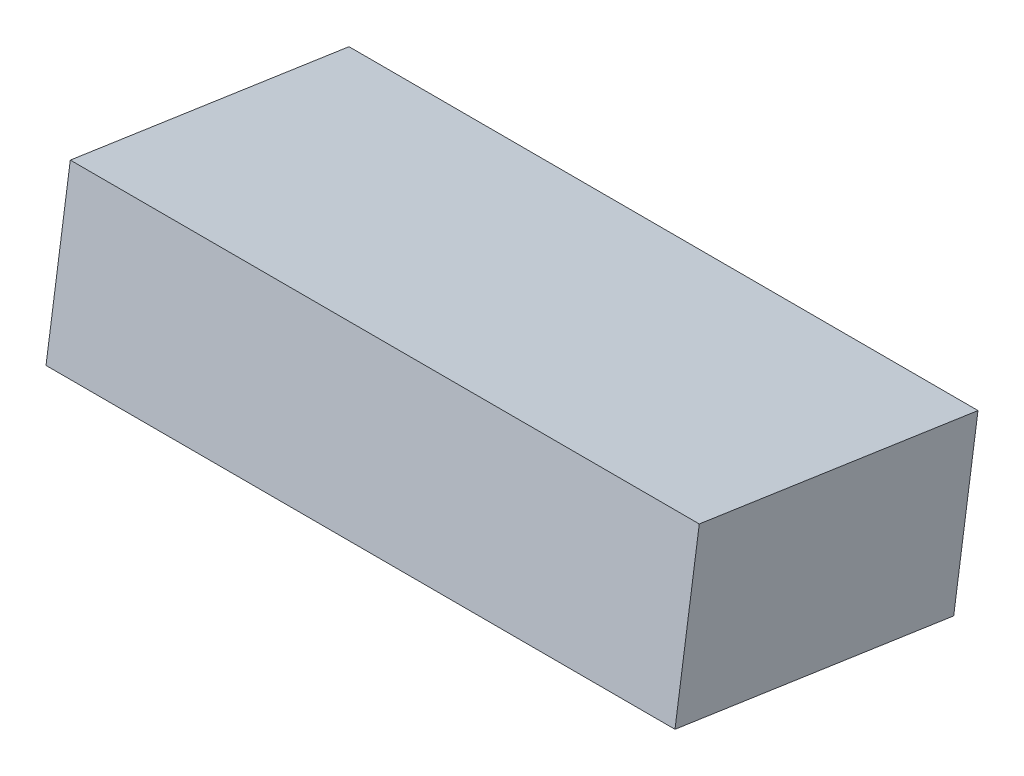
ISO-10303-21;
HEADER;
FILE_DESCRIPTION(('STEP AP214'),'2;1');
FILE_NAME('part.step','',(''),(''),'','','');
FILE_SCHEMA(('AUTOMOTIVE_DESIGN { 1 0 10303 214 1 1 1 1 }'));
ENDSEC;
DATA;
#1=APPLICATION_CONTEXT('core data for automotive mechanical design processes');
#2=APPLICATION_PROTOCOL_DEFINITION('international standard','automotive_design',2000,#1);
#3=PRODUCT_CONTEXT('',#1,'mechanical');
#4=PRODUCT('Part','Part','',(#3));
#5=PRODUCT_RELATED_PRODUCT_CATEGORY('part','',(#4));
#6=PRODUCT_DEFINITION_FORMATION('','',#4);
#7=PRODUCT_DEFINITION_CONTEXT('part definition',#1,'design');
#8=PRODUCT_DEFINITION('design','',#6,#7);
#9=PRODUCT_DEFINITION_SHAPE('','',#8);
#10=(LENGTH_UNIT() NAMED_UNIT(*) SI_UNIT(.MILLI.,.METRE.));
#11=(NAMED_UNIT(*) PLANE_ANGLE_UNIT() SI_UNIT($,.RADIAN.));
#12=(NAMED_UNIT(*) SI_UNIT($,.STERADIAN.) SOLID_ANGLE_UNIT());
#13=UNCERTAINTY_MEASURE_WITH_UNIT(LENGTH_MEASURE(1.E-05),#10,'distance_accuracy_value','');
#14=(GEOMETRIC_REPRESENTATION_CONTEXT(3) GLOBAL_UNCERTAINTY_ASSIGNED_CONTEXT((#13)) GLOBAL_UNIT_ASSIGNED_CONTEXT((#10,
#11,#12)) REPRESENTATION_CONTEXT('',''));
#15=CARTESIAN_POINT('',(0.,0.,0.));
#16=DIRECTION('',(0.,0.,1.));
#17=DIRECTION('',(1.,0.,0.));
#18=AXIS2_PLACEMENT_3D('',#15,#16,#17);
#19=CARTESIAN_POINT('',(-480.833649267129,-237.147620544368,-497.157132482097));
#20=DIRECTION('',(-0.999999301103801,-0.000171497666052407,-0.00116977795300064));
#21=DIRECTION('',(-0.00116977797020307,0.,0.999999315809516));
#22=AXIS2_PLACEMENT_3D('',#19,#20,#21);
#23=PLANE('',#22);
#24=DIRECTION('',(0.,-0.989423385211912,0.145056419353992));
#25=VECTOR('',#24,1.);
#26=CARTESIAN_POINT('',(-480.883305132111,-231.055255189434,-455.601379346375));
#27=LINE('',#26,#25);
#28=CARTESIAN_POINT('',(-480.883305132111,-231.055255189434,-455.601379346375));
#29=VERTEX_POINT('',#28);
#30=CARTESIAN_POINT('',(-480.883305132111,-255.790839819758,-451.974968862522));
#31=VERTEX_POINT('',#30);
#32=EDGE_CURVE('E86',#29,#31,#27,.T.);
#33=ORIENTED_EDGE('',*,*,#32,.F.);
#34=DIRECTION('',(-0.00118228249956928,0.145056317974611,0.989422693707669));
#35=VECTOR('',#34,1.);
#36=CARTESIAN_POINT('',(-480.833649267129,-237.147620544368,-497.157132482097));
#37=LINE('',#36,#35);
#38=CARTESIAN_POINT('',(-480.833649267129,-237.147620544368,-497.157132482097));
#39=VERTEX_POINT('',#38);
#40=EDGE_CURVE('E83',#39,#29,#37,.T.);
#41=ORIENTED_EDGE('',*,*,#40,.F.);
#42=DIRECTION('',(0.,-0.989423385211912,0.145056419353992));
#43=VECTOR('',#42,1.);
#44=CARTESIAN_POINT('',(-480.833649267129,-237.147620544368,-497.157132482097));
#45=LINE('',#44,#43);
#46=CARTESIAN_POINT('',(-480.833649267129,-261.883205174692,-493.530721998244));
#47=VERTEX_POINT('',#46);
#48=EDGE_CURVE('E85',#39,#47,#45,.T.);
#49=ORIENTED_EDGE('',*,*,#48,.T.);
#50=DIRECTION('',(-0.00118228249956928,0.145056317974611,0.989422693707669));
#51=VECTOR('',#50,1.);
#52=CARTESIAN_POINT('',(-480.833649267129,-261.883205174692,-493.530721998244));
#53=LINE('',#52,#51);
#54=EDGE_CURVE('E73',#47,#31,#53,.T.);
#55=ORIENTED_EDGE('',*,*,#54,.T.);
#56=EDGE_LOOP('',(#33,#41,#49,#55));
#57=FACE_BOUND('',#56,.T.);
#58=ADVANCED_FACE('F40',(#57),#23,.T.);
#59=CARTESIAN_POINT('',(-415.869690941069,-232.720030516504,-466.956737813449));
#60=DIRECTION('',(0.,-0.989423385211912,0.145056419353991));
#61=DIRECTION('',(-2.51049398555384E-13,-0.145056419353991,-0.989423385211912));
#62=AXIS2_PLACEMENT_3D('',#59,#60,#61);
#63=PLANE('',#62);
#64=DIRECTION('',(-0.999999301103801,-0.000171497666052506,-0.00116977795300063));
#65=VECTOR('',#64,1.);
#66=CARTESIAN_POINT('',(-386.883370828126,-231.039134408825,-455.491420218793));
#67=LINE('',#66,#65);
#68=CARTESIAN_POINT('',(-386.883370828126,-231.039134408825,-455.491420218793));
#69=VERTEX_POINT('',#68);
#70=EDGE_CURVE('E110',#69,#29,#67,.T.);
#71=ORIENTED_EDGE('',*,*,#70,.F.);
#72=DIRECTION('',(-0.00118228249956928,0.145056317974611,0.989422693707669));
#73=VECTOR('',#72,1.);
#74=CARTESIAN_POINT('',(-386.833714963144,-237.131499763759,-497.047173354515));
#75=LINE('',#74,#73);
#76=CARTESIAN_POINT('',(-386.833714963144,-237.131499763759,-497.047173354515));
#77=VERTEX_POINT('',#76);
#78=EDGE_CURVE('E92',#77,#69,#75,.T.);
#79=ORIENTED_EDGE('',*,*,#78,.F.);
#80=DIRECTION('',(-0.999999301103801,-0.000171497666052506,-0.00116977795300063));
#81=VECTOR('',#80,1.);
#82=CARTESIAN_POINT('',(-386.833714963144,-237.131499763759,-497.047173354515));
#83=LINE('',#82,#81);
#84=EDGE_CURVE('E95',#77,#39,#83,.T.);
#85=ORIENTED_EDGE('',*,*,#84,.T.);
#86=ORIENTED_EDGE('',*,*,#40,.T.);
#87=EDGE_LOOP('',(#71,#79,#85,#86));
#88=FACE_BOUND('',#87,.T.);
#89=ADVANCED_FACE('F100',(#88),#63,.F.);
#90=CARTESIAN_POINT('',(-415.869690941068,-257.455615146802,-463.330327329599));
#91=DIRECTION('',(0.,0.989423385211912,-0.145056419353991));
#92=DIRECTION('',(1.,0.,-2.55160680521546E-13));
#93=AXIS2_PLACEMENT_3D('',#90,#91,#92);
#94=PLANE('',#93);
#95=DIRECTION('',(0.999999301103801,0.000171497666052506,0.00116977795300063));
#96=VECTOR('',#95,1.);
#97=CARTESIAN_POINT('',(-386.883370828126,-255.774719039149,-451.865009734939));
#98=LINE('',#97,#96);
#99=CARTESIAN_POINT('',(-386.883370828126,-255.774719039149,-451.865009734939));
#100=VERTEX_POINT('',#99);
#101=EDGE_CURVE('E102',#31,#100,#98,.T.);
#102=ORIENTED_EDGE('',*,*,#101,.F.);
#103=ORIENTED_EDGE('',*,*,#54,.F.);
#104=DIRECTION('',(0.999999301103801,0.000171497666052506,0.00116977795300063));
#105=VECTOR('',#104,1.);
#106=CARTESIAN_POINT('',(-386.833714963144,-261.867084394082,-493.420762870661));
#107=LINE('',#106,#105);
#108=CARTESIAN_POINT('',(-386.833714963144,-261.867084394082,-493.420762870661));
#109=VERTEX_POINT('',#108);
#110=EDGE_CURVE('E97',#47,#109,#107,.T.);
#111=ORIENTED_EDGE('',*,*,#110,.T.);
#112=DIRECTION('',(-0.00118228249956928,0.145056317974611,0.989422693707669));
#113=VECTOR('',#112,1.);
#114=CARTESIAN_POINT('',(-386.833714963144,-261.867084394082,-493.420762870661));
#115=LINE('',#114,#113);
#116=EDGE_CURVE('E115',#109,#100,#115,.T.);
#117=ORIENTED_EDGE('',*,*,#116,.T.);
#118=EDGE_LOOP('',(#102,#103,#111,#117));
#119=FACE_BOUND('',#118,.T.);
#120=ADVANCED_FACE('F132',(#119),#94,.F.);
#121=CARTESIAN_POINT('',(-374.333723699366,-259.391382210212,-493.768781694636));
#122=DIRECTION('',(-0.00118228249956928,0.145056317974611,0.989422693707669));
#123=DIRECTION('',(-3.10372782254546E-12,0.989423385211911,-0.145056419353995));
#124=AXIS2_PLACEMENT_3D('',#121,#122,#123);
#125=PLANE('',#124);
#126=ORIENTED_EDGE('',*,*,#84,.F.);
#127=DIRECTION('',(0.,0.989423385211912,-0.145056419353991));
#128=VECTOR('',#127,1.);
#129=CARTESIAN_POINT('',(-386.833714963153,-257.399204293269,-494.075785482036));
#130=LINE('',#129,#128);
#131=EDGE_CURVE('E11',#109,#77,#130,.T.);
#132=ORIENTED_EDGE('',*,*,#131,.F.);
#133=ORIENTED_EDGE('',*,*,#110,.F.);
#134=ORIENTED_EDGE('',*,*,#48,.F.);
#135=EDGE_LOOP('',(#126,#132,#133,#134));
#136=FACE_BOUND('',#135,.T.);
#137=ADVANCED_FACE('F94',(#136),#125,.F.);
#138=CARTESIAN_POINT('',(-386.834897245663,-242.560628039298,-495.240536038596));
#139=DIRECTION('',(0.999999301103801,0.000171497666098561,0.00116977795299387));
#140=DIRECTION('',(0.,-0.989423385210084,0.145056419366457));
#141=AXIS2_PLACEMENT_3D('',#138,#139,#140);
#142=PLANE('',#141);
#143=ORIENTED_EDGE('',*,*,#131,.T.);
#144=ORIENTED_EDGE('',*,*,#78,.T.);
#145=DIRECTION('',(0.,0.989423385211912,-0.145056419353991));
#146=VECTOR('',#145,1.);
#147=CARTESIAN_POINT('',(-386.883370828136,-251.306838938333,-452.520032346294));
#148=LINE('',#147,#146);
#149=EDGE_CURVE('E50',#100,#69,#148,.T.);
#150=ORIENTED_EDGE('',*,*,#149,.F.);
#151=ORIENTED_EDGE('',*,*,#116,.F.);
#152=EDGE_LOOP('',(#143,#144,#150,#151));
#153=FACE_BOUND('',#152,.T.);
#154=ADVANCED_FACE('F42',(#153),#142,.T.);
#155=CARTESIAN_POINT('',(-415.883350560155,-253.30613400842,-452.261574343963));
#156=DIRECTION('',(0.00118228249956928,-0.145056317974611,-0.989422693707669));
#157=DIRECTION('',(0.,-0.989423385211912,0.145056419353991));
#158=AXIS2_PLACEMENT_3D('',#155,#156,#157);
#159=PLANE('',#158);
#160=ORIENTED_EDGE('',*,*,#149,.T.);
#161=ORIENTED_EDGE('',*,*,#70,.T.);
#162=ORIENTED_EDGE('',*,*,#32,.T.);
#163=ORIENTED_EDGE('',*,*,#101,.T.);
#164=EDGE_LOOP('',(#160,#161,#162,#163));
#165=FACE_BOUND('',#164,.T.);
#166=ADVANCED_FACE('F124',(#165),#159,.F.);
#167=CLOSED_SHELL('',(#58,#89,#120,#137,#154,#166));
#168=MANIFOLD_SOLID_BREP('B2',#167);
#169=ADVANCED_BREP_SHAPE_REPRESENTATION('',(#18,#168),#14);
#170=SHAPE_DEFINITION_REPRESENTATION(#9,#169);
ENDSEC;
END-ISO-10303-21;
